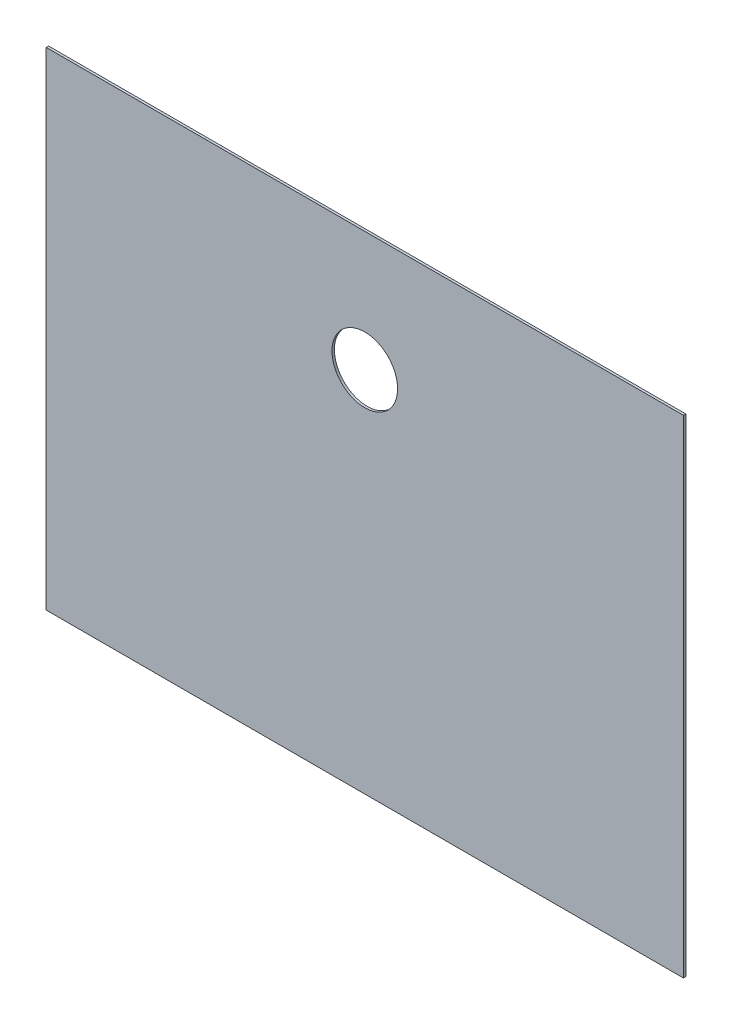
ISO-10303-21;
HEADER;
FILE_DESCRIPTION(('STEP AP214'),'2;1');
FILE_NAME('part.step','',(''),(''),'','','');
FILE_SCHEMA(('AUTOMOTIVE_DESIGN { 1 0 10303 214 1 1 1 1 }'));
ENDSEC;
DATA;
#1=APPLICATION_CONTEXT('core data for automotive mechanical design processes');
#2=APPLICATION_PROTOCOL_DEFINITION('international standard','automotive_design',2000,#1);
#3=PRODUCT_CONTEXT('',#1,'mechanical');
#4=PRODUCT('Part','Part','',(#3));
#5=PRODUCT_RELATED_PRODUCT_CATEGORY('part','',(#4));
#6=PRODUCT_DEFINITION_FORMATION('','',#4);
#7=PRODUCT_DEFINITION_CONTEXT('part definition',#1,'design');
#8=PRODUCT_DEFINITION('design','',#6,#7);
#9=PRODUCT_DEFINITION_SHAPE('','',#8);
#10=(LENGTH_UNIT() NAMED_UNIT(*) SI_UNIT(.MILLI.,.METRE.));
#11=(NAMED_UNIT(*) PLANE_ANGLE_UNIT() SI_UNIT($,.RADIAN.));
#12=(NAMED_UNIT(*) SI_UNIT($,.STERADIAN.) SOLID_ANGLE_UNIT());
#13=UNCERTAINTY_MEASURE_WITH_UNIT(LENGTH_MEASURE(1.E-05),#10,'distance_accuracy_value','');
#14=(GEOMETRIC_REPRESENTATION_CONTEXT(3) GLOBAL_UNCERTAINTY_ASSIGNED_CONTEXT((#13)) GLOBAL_UNIT_ASSIGNED_CONTEXT((#10,
#11,#12)) REPRESENTATION_CONTEXT('',''));
#15=CARTESIAN_POINT('',(0.,0.,0.));
#16=DIRECTION('',(0.,0.,1.));
#17=DIRECTION('',(1.,0.,0.));
#18=AXIS2_PLACEMENT_3D('',#15,#16,#17);
#19=CARTESIAN_POINT('',(-17.,-19.6,0.));
#20=DIRECTION('',(0.,0.,1.));
#21=DIRECTION('',(1.,0.,0.));
#22=AXIS2_PLACEMENT_3D('',#19,#20,#21);
#23=PLANE('',#22);
#24=CARTESIAN_POINT('',(0.,0.,0.));
#25=DIRECTION('',(0.,0.,-1.));
#26=DIRECTION('',(-1.,0.,0.));
#27=AXIS2_PLACEMENT_3D('',#24,#25,#26);
#28=CIRCLE('',#27,1.75);
#29=CARTESIAN_POINT('',(-1.75,0.,0.));
#30=VERTEX_POINT('',#29);
#31=EDGE_CURVE('E20',#30,#30,#28,.F.);
#32=ORIENTED_EDGE('',*,*,#31,.T.);
#33=EDGE_LOOP('',(#32));
#34=FACE_BOUND('',#33,.T.);
#35=DIRECTION('',(1.,0.,0.));
#36=VECTOR('',#35,1.);
#37=CARTESIAN_POINT('',(-17.,6.40000000000002,0.));
#38=LINE('',#37,#36);
#39=CARTESIAN_POINT('',(-17.,6.40000000000002,0.));
#40=VERTEX_POINT('',#39);
#41=CARTESIAN_POINT('',(17.,6.40000000000002,0.));
#42=VERTEX_POINT('',#41);
#43=EDGE_CURVE('E83',#40,#42,#38,.T.);
#44=ORIENTED_EDGE('',*,*,#43,.T.);
#45=DIRECTION('',(0.,-1.,0.));
#46=VECTOR('',#45,1.);
#47=CARTESIAN_POINT('',(17.,6.40000000000002,0.));
#48=LINE('',#47,#46);
#49=CARTESIAN_POINT('',(17.,-19.6,0.));
#50=VERTEX_POINT('',#49);
#51=EDGE_CURVE('E69',#42,#50,#48,.T.);
#52=ORIENTED_EDGE('',*,*,#51,.T.);
#53=DIRECTION('',(-1.,0.,0.));
#54=VECTOR('',#53,1.);
#55=CARTESIAN_POINT('',(-17.,-19.6,0.));
#56=LINE('',#55,#54);
#57=CARTESIAN_POINT('',(-17.,-19.6,0.));
#58=VERTEX_POINT('',#57);
#59=EDGE_CURVE('E54',#50,#58,#56,.T.);
#60=ORIENTED_EDGE('',*,*,#59,.T.);
#61=DIRECTION('',(0.,1.,0.));
#62=VECTOR('',#61,1.);
#63=CARTESIAN_POINT('',(-17.,6.40000000000002,0.));
#64=LINE('',#63,#62);
#65=EDGE_CURVE('E59',#58,#40,#64,.T.);
#66=ORIENTED_EDGE('',*,*,#65,.T.);
#67=EDGE_LOOP('',(#44,#52,#60,#66));
#68=FACE_BOUND('',#67,.T.);
#69=ADVANCED_FACE('F17',(#34,#68),#23,.F.);
#70=CARTESIAN_POINT('',(-17.,6.40000000000002,0.126999999999995));
#71=DIRECTION('',(1.,0.,0.));
#72=DIRECTION('',(0.,1.,0.));
#73=AXIS2_PLACEMENT_3D('',#70,#71,#72);
#74=PLANE('',#73);
#75=DIRECTION('',(0.,0.,1.));
#76=VECTOR('',#75,1.);
#77=CARTESIAN_POINT('',(-17.,-19.6,0.126999999999995));
#78=LINE('',#77,#76);
#79=CARTESIAN_POINT('',(-17.,-19.6,0.126999999999995));
#80=VERTEX_POINT('',#79);
#81=EDGE_CURVE('E61',#58,#80,#78,.T.);
#82=ORIENTED_EDGE('',*,*,#81,.T.);
#83=DIRECTION('',(0.,1.,0.));
#84=VECTOR('',#83,1.);
#85=CARTESIAN_POINT('',(-17.,-19.6,0.126999999999995));
#86=LINE('',#85,#84);
#87=CARTESIAN_POINT('',(-17.,6.40000000000002,0.126999999999985));
#88=VERTEX_POINT('',#87);
#89=EDGE_CURVE('E85',#88,#80,#86,.F.);
#90=ORIENTED_EDGE('',*,*,#89,.F.);
#91=DIRECTION('',(0.,0.,1.));
#92=VECTOR('',#91,1.);
#93=CARTESIAN_POINT('',(-17.,6.40000000000002,0.126999999999995));
#94=LINE('',#93,#92);
#95=EDGE_CURVE('E64',#88,#40,#94,.F.);
#96=ORIENTED_EDGE('',*,*,#95,.T.);
#97=ORIENTED_EDGE('',*,*,#65,.F.);
#98=EDGE_LOOP('',(#82,#90,#96,#97));
#99=FACE_BOUND('',#98,.T.);
#100=ADVANCED_FACE('F60',(#99),#74,.F.);
#101=CARTESIAN_POINT('',(-17.,-19.6,0.126999999999995));
#102=DIRECTION('',(0.,1.,0.));
#103=DIRECTION('',(-1.,0.,0.));
#104=AXIS2_PLACEMENT_3D('',#101,#102,#103);
#105=PLANE('',#104);
#106=DIRECTION('',(0.,0.,1.));
#107=VECTOR('',#106,1.);
#108=CARTESIAN_POINT('',(17.,-19.6,0.126999999999954));
#109=LINE('',#108,#107);
#110=CARTESIAN_POINT('',(17.,-19.6,0.126999999999993));
#111=VERTEX_POINT('',#110);
#112=EDGE_CURVE('E71',#50,#111,#109,.T.);
#113=ORIENTED_EDGE('',*,*,#112,.T.);
#114=DIRECTION('',(1.,0.,0.));
#115=VECTOR('',#114,1.);
#116=CARTESIAN_POINT('',(-17.,-19.6,0.126999999999995));
#117=LINE('',#116,#115);
#118=EDGE_CURVE('E75',#80,#111,#117,.T.);
#119=ORIENTED_EDGE('',*,*,#118,.F.);
#120=ORIENTED_EDGE('',*,*,#81,.F.);
#121=ORIENTED_EDGE('',*,*,#59,.F.);
#122=EDGE_LOOP('',(#113,#119,#120,#121));
#123=FACE_BOUND('',#122,.T.);
#124=ADVANCED_FACE('F73',(#123),#105,.F.);
#125=CARTESIAN_POINT('',(17.,6.40000000000002,0.126999999999954));
#126=DIRECTION('',(-1.,0.,0.));
#127=DIRECTION('',(0.,-1.,0.));
#128=AXIS2_PLACEMENT_3D('',#125,#126,#127);
#129=PLANE('',#128);
#130=DIRECTION('',(0.,0.,1.));
#131=VECTOR('',#130,1.);
#132=CARTESIAN_POINT('',(17.,6.40000000000002,0.126999999999995));
#133=LINE('',#132,#131);
#134=CARTESIAN_POINT('',(17.,6.40000000000002,0.126999999999981));
#135=VERTEX_POINT('',#134);
#136=EDGE_CURVE('E34',#42,#135,#133,.T.);
#137=ORIENTED_EDGE('',*,*,#136,.T.);
#138=DIRECTION('',(0.,1.,0.));
#139=VECTOR('',#138,1.);
#140=CARTESIAN_POINT('',(17.,-19.6,0.126999999999995));
#141=LINE('',#140,#139);
#142=EDGE_CURVE('E88',#111,#135,#141,.T.);
#143=ORIENTED_EDGE('',*,*,#142,.F.);
#144=ORIENTED_EDGE('',*,*,#112,.F.);
#145=ORIENTED_EDGE('',*,*,#51,.F.);
#146=EDGE_LOOP('',(#137,#143,#144,#145));
#147=FACE_BOUND('',#146,.T.);
#148=ADVANCED_FACE('F98',(#147),#129,.F.);
#149=CARTESIAN_POINT('',(-17.,6.40000000000002,0.126999999999995));
#150=DIRECTION('',(0.,-1.,0.));
#151=DIRECTION('',(1.,0.,0.));
#152=AXIS2_PLACEMENT_3D('',#149,#150,#151);
#153=PLANE('',#152);
#154=ORIENTED_EDGE('',*,*,#95,.F.);
#155=DIRECTION('',(1.,0.,0.));
#156=VECTOR('',#155,1.);
#157=CARTESIAN_POINT('',(-17.,6.40000000000002,0.126999999999995));
#158=LINE('',#157,#156);
#159=EDGE_CURVE('E26',#135,#88,#158,.F.);
#160=ORIENTED_EDGE('',*,*,#159,.F.);
#161=ORIENTED_EDGE('',*,*,#136,.F.);
#162=ORIENTED_EDGE('',*,*,#43,.F.);
#163=EDGE_LOOP('',(#154,#160,#161,#162));
#164=FACE_BOUND('',#163,.T.);
#165=ADVANCED_FACE('F95',(#164),#153,.F.);
#166=CARTESIAN_POINT('',(0.,0.,0.127000000000002));
#167=DIRECTION('',(0.,0.,-1.));
#168=DIRECTION('',(-1.,0.,0.));
#169=AXIS2_PLACEMENT_3D('',#166,#167,#168);
#170=CYLINDRICAL_SURFACE('',#169,1.75);
#171=CARTESIAN_POINT('',(0.,0.,0.127000000000002));
#172=DIRECTION('',(0.,0.,-1.));
#173=DIRECTION('',(-1.,0.,0.));
#174=AXIS2_PLACEMENT_3D('',#171,#172,#173);
#175=CIRCLE('',#174,1.75);
#176=CARTESIAN_POINT('',(-1.75,0.,0.127000000000002));
#177=VERTEX_POINT('',#176);
#178=EDGE_CURVE('E11',#177,#177,#175,.T.);
#179=ORIENTED_EDGE('',*,*,#178,.F.);
#180=EDGE_LOOP('',(#179));
#181=FACE_BOUND('',#180,.T.);
#182=ORIENTED_EDGE('',*,*,#31,.F.);
#183=EDGE_LOOP('',(#182));
#184=FACE_BOUND('',#183,.T.);
#185=ADVANCED_FACE('F97',(#181,#184),#170,.F.);
#186=CARTESIAN_POINT('',(-17.,-19.6,0.126999999999995));
#187=DIRECTION('',(0.,0.,1.));
#188=DIRECTION('',(1.,0.,0.));
#189=AXIS2_PLACEMENT_3D('',#186,#187,#188);
#190=PLANE('',#189);
#191=ORIENTED_EDGE('',*,*,#178,.T.);
#192=EDGE_LOOP('',(#191));
#193=FACE_BOUND('',#192,.T.);
#194=ORIENTED_EDGE('',*,*,#142,.T.);
#195=ORIENTED_EDGE('',*,*,#159,.T.);
#196=ORIENTED_EDGE('',*,*,#89,.T.);
#197=ORIENTED_EDGE('',*,*,#118,.T.);
#198=EDGE_LOOP('',(#194,#195,#196,#197));
#199=FACE_BOUND('',#198,.T.);
#200=ADVANCED_FACE('F93',(#193,#199),#190,.T.);
#201=CLOSED_SHELL('',(#69,#100,#124,#148,#165,#185,#200));
#202=MANIFOLD_SOLID_BREP('B1',#201);
#203=ADVANCED_BREP_SHAPE_REPRESENTATION('',(#18,#202),#14);
#204=SHAPE_DEFINITION_REPRESENTATION(#9,#203);
ENDSEC;
END-ISO-10303-21;
